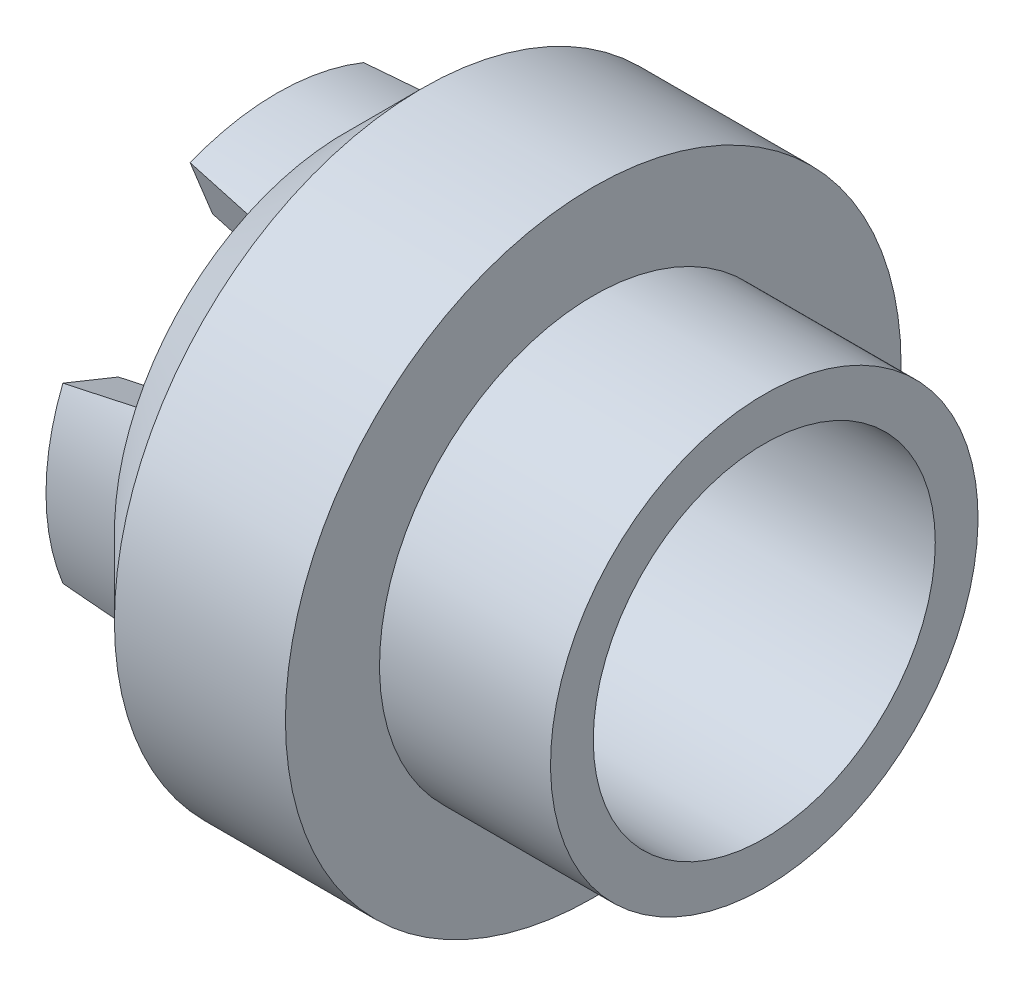
ISO-10303-21;
HEADER;
FILE_DESCRIPTION(('STEP AP214'),'2;1');
FILE_NAME('part.step','',(''),(''),'','','');
FILE_SCHEMA(('AUTOMOTIVE_DESIGN { 1 0 10303 214 1 1 1 1 }'));
ENDSEC;
DATA;
#1=APPLICATION_CONTEXT('core data for automotive mechanical design processes');
#2=APPLICATION_PROTOCOL_DEFINITION('international standard','automotive_design',2000,#1);
#3=PRODUCT_CONTEXT('',#1,'mechanical');
#4=PRODUCT('Part','Part','',(#3));
#5=PRODUCT_RELATED_PRODUCT_CATEGORY('part','',(#4));
#6=PRODUCT_DEFINITION_FORMATION('','',#4);
#7=PRODUCT_DEFINITION_CONTEXT('part definition',#1,'design');
#8=PRODUCT_DEFINITION('design','',#6,#7);
#9=PRODUCT_DEFINITION_SHAPE('','',#8);
#10=(LENGTH_UNIT() NAMED_UNIT(*) SI_UNIT(.MILLI.,.METRE.));
#11=(NAMED_UNIT(*) PLANE_ANGLE_UNIT() SI_UNIT($,.RADIAN.));
#12=(NAMED_UNIT(*) SI_UNIT($,.STERADIAN.) SOLID_ANGLE_UNIT());
#13=UNCERTAINTY_MEASURE_WITH_UNIT(LENGTH_MEASURE(1.E-05),#10,'distance_accuracy_value','');
#14=(GEOMETRIC_REPRESENTATION_CONTEXT(3) GLOBAL_UNCERTAINTY_ASSIGNED_CONTEXT((#13)) GLOBAL_UNIT_ASSIGNED_CONTEXT((#10,
#11,#12)) REPRESENTATION_CONTEXT('',''));
#15=CARTESIAN_POINT('',(0.,0.,0.));
#16=DIRECTION('',(0.,0.,1.));
#17=DIRECTION('',(1.,0.,0.));
#18=AXIS2_PLACEMENT_3D('',#15,#16,#17);
#19=CARTESIAN_POINT('',(-15.5575,0.,0.));
#20=DIRECTION('',(1.,0.,0.));
#21=DIRECTION('',(0.,1.,0.));
#22=AXIS2_PLACEMENT_3D('',#19,#20,#21);
#23=PLANE('',#22);
#24=CARTESIAN_POINT('',(-15.5575,0.,0.));
#25=DIRECTION('',(-1.,0.,0.));
#26=DIRECTION('',(0.,-1.,0.));
#27=AXIS2_PLACEMENT_3D('',#24,#25,#26);
#28=CIRCLE('',#27,8.5725);
#29=CARTESIAN_POINT('',(-15.5575,7.76570118319577,-3.63065302436239));
#30=VERTEX_POINT('',#29);
#31=CARTESIAN_POINT('',(-15.5575,3.63065302436247,-7.76570118319574));
#32=VERTEX_POINT('',#31);
#33=EDGE_CURVE('E246',#30,#32,#28,.T.);
#34=ORIENTED_EDGE('',*,*,#33,.T.);
#35=DIRECTION('',(0.,-0.374606593415919,0.927183854566784));
#36=VECTOR('',#35,1.);
#37=CARTESIAN_POINT('',(-15.5575,2.80266032649904,-5.71634734198931));
#38=LINE('',#37,#36);
#39=CARTESIAN_POINT('',(-15.5575,2.79648659009784,-5.70106680818625));
#40=VERTEX_POINT('',#39);
#41=EDGE_CURVE('E237',#32,#40,#38,.T.);
#42=ORIENTED_EDGE('',*,*,#41,.T.);
#43=CARTESIAN_POINT('',(-15.5575,0.,0.));
#44=DIRECTION('',(1.,0.,0.));
#45=DIRECTION('',(0.,0.,-1.));
#46=AXIS2_PLACEMENT_3D('',#43,#44,#45);
#47=CIRCLE('',#46,6.35);
#48=CARTESIAN_POINT('',(-15.5575,5.70106680818628,-2.79648659009778));
#49=VERTEX_POINT('',#48);
#50=EDGE_CURVE('E182',#40,#49,#47,.T.);
#51=ORIENTED_EDGE('',*,*,#50,.T.);
#52=DIRECTION('',(0.,0.927183854566788,-0.37460659341591));
#53=VECTOR('',#52,1.);
#54=CARTESIAN_POINT('',(-15.5575,7.77701345876403,-3.63522348036584));
#55=LINE('',#54,#53);
#56=EDGE_CURVE('E172',#49,#30,#55,.T.);
#57=ORIENTED_EDGE('',*,*,#56,.T.);
#58=EDGE_LOOP('',(#34,#42,#51,#57));
#59=FACE_BOUND('',#58,.T.);
#60=ADVANCED_FACE('F36',(#59),#23,.F.);
#61=CARTESIAN_POINT('',(-15.5575,-5.70106680818628,-2.79648659009778));
#62=VERTEX_POINT('',#61);
#63=CARTESIAN_POINT('',(-15.5575,-2.79648659009772,-5.70106680818631));
#64=VERTEX_POINT('',#63);
#65=EDGE_CURVE('E187',#62,#64,#47,.T.);
#66=ORIENTED_EDGE('',*,*,#65,.T.);
#67=DIRECTION('',(0.,-0.3746065934159,-0.927183854566792));
#68=VECTOR('',#67,1.);
#69=CARTESIAN_POINT('',(-15.5575,-3.63522348036576,-7.77701345876407));
#70=LINE('',#69,#68);
#71=CARTESIAN_POINT('',(-15.5575,-3.63065302436231,-7.76570118319581));
#72=VERTEX_POINT('',#71);
#73=EDGE_CURVE('E240',#64,#72,#70,.T.);
#74=ORIENTED_EDGE('',*,*,#73,.T.);
#75=CARTESIAN_POINT('',(-15.5575,-7.76570118319577,-3.63065302436239));
#76=VERTEX_POINT('',#75);
#77=EDGE_CURVE('E311',#72,#76,#28,.T.);
#78=ORIENTED_EDGE('',*,*,#77,.T.);
#79=DIRECTION('',(0.,0.927183854566789,0.37460659341591));
#80=VECTOR('',#79,1.);
#81=CARTESIAN_POINT('',(-15.5575,-5.71634734198934,-2.80266032649898));
#82=LINE('',#81,#80);
#83=EDGE_CURVE('E290',#76,#62,#82,.T.);
#84=ORIENTED_EDGE('',*,*,#83,.T.);
#85=EDGE_LOOP('',(#66,#74,#78,#84));
#86=FACE_BOUND('',#85,.T.);
#87=ADVANCED_FACE('F310',(#86),#23,.F.);
#88=CARTESIAN_POINT('',(-15.5575,-2.7964865900978,5.70106680818626));
#89=VERTEX_POINT('',#88);
#90=CARTESIAN_POINT('',(-15.5575,-5.70106680818628,2.79648659009778));
#91=VERTEX_POINT('',#90);
#92=EDGE_CURVE('E180',#89,#91,#47,.T.);
#93=ORIENTED_EDGE('',*,*,#92,.T.);
#94=DIRECTION('',(0.,-0.927183854566788,0.37460659341591));
#95=VECTOR('',#94,1.);
#96=CARTESIAN_POINT('',(-15.5575,-7.77701345876403,3.63522348036584));
#97=LINE('',#96,#95);
#98=CARTESIAN_POINT('',(-15.5575,-7.76570118319578,3.63065302436239));
#99=VERTEX_POINT('',#98);
#100=EDGE_CURVE('E287',#91,#99,#97,.T.);
#101=ORIENTED_EDGE('',*,*,#100,.T.);
#102=CARTESIAN_POINT('',(-15.5575,-3.63065302436242,7.76570118319576));
#103=VERTEX_POINT('',#102);
#104=EDGE_CURVE('E317',#99,#103,#28,.T.);
#105=ORIENTED_EDGE('',*,*,#104,.T.);
#106=DIRECTION('',(0.,0.374606593415913,-0.927183854566787));
#107=VECTOR('',#106,1.);
#108=CARTESIAN_POINT('',(-15.5575,-2.802660326499,5.71634734198933));
#109=LINE('',#108,#107);
#110=EDGE_CURVE('E268',#103,#89,#109,.T.);
#111=ORIENTED_EDGE('',*,*,#110,.T.);
#112=EDGE_LOOP('',(#93,#101,#105,#111));
#113=FACE_BOUND('',#112,.T.);
#114=ADVANCED_FACE('F355',(#113),#23,.F.);
#115=CARTESIAN_POINT('',(-15.5575,5.70106680818628,2.79648659009778));
#116=VERTEX_POINT('',#115);
#117=CARTESIAN_POINT('',(-15.5575,2.79648659009776,5.70106680818629));
#118=VERTEX_POINT('',#117);
#119=EDGE_CURVE('E167',#116,#118,#47,.T.);
#120=ORIENTED_EDGE('',*,*,#119,.T.);
#121=DIRECTION('',(0.,0.374606593415907,0.92718385456679));
#122=VECTOR('',#121,1.);
#123=CARTESIAN_POINT('',(-15.5575,3.63522348036581,7.77701345876404));
#124=LINE('',#123,#122);
#125=CARTESIAN_POINT('',(-15.5575,3.63065302436236,7.76570118319579));
#126=VERTEX_POINT('',#125);
#127=EDGE_CURVE('E160',#118,#126,#124,.T.);
#128=ORIENTED_EDGE('',*,*,#127,.T.);
#129=CARTESIAN_POINT('',(-15.5575,7.76570118319577,3.63065302436239));
#130=VERTEX_POINT('',#129);
#131=EDGE_CURVE('E170',#126,#130,#28,.T.);
#132=ORIENTED_EDGE('',*,*,#131,.T.);
#133=DIRECTION('',(0.,-0.927183854566789,-0.37460659341591));
#134=VECTOR('',#133,1.);
#135=CARTESIAN_POINT('',(-15.5575,5.71634734198934,2.80266032649898));
#136=LINE('',#135,#134);
#137=EDGE_CURVE('E155',#130,#116,#136,.T.);
#138=ORIENTED_EDGE('',*,*,#137,.T.);
#139=EDGE_LOOP('',(#120,#128,#132,#138));
#140=FACE_BOUND('',#139,.T.);
#141=ADVANCED_FACE('F165',(#140),#23,.F.);
#142=CARTESIAN_POINT('',(-12.7,0.,0.));
#143=DIRECTION('',(1.,0.,0.));
#144=DIRECTION('',(0.,1.,0.));
#145=AXIS2_PLACEMENT_3D('',#142,#143,#144);
#146=CONICAL_SURFACE('',#145,11.43,0.78539816339745);
#147=EDGE_CURVE('E173',#130,#30,#28,.T.);
#148=ORIENTED_EDGE('',*,*,#147,.F.);
#149=ORIENTED_EDGE('',*,*,#131,.F.);
#150=CARTESIAN_POINT('',(-15.5575,0.,0.));
#151=DIRECTION('',(-1.,0.,0.));
#152=DIRECTION('',(0.,-1.,0.));
#153=AXIS2_PLACEMENT_3D('',#150,#151,#152);
#154=CIRCLE('',#153,8.5725);
#155=EDGE_CURVE('E204',#103,#126,#154,.T.);
#156=ORIENTED_EDGE('',*,*,#155,.F.);
#157=ORIENTED_EDGE('',*,*,#104,.F.);
#158=CARTESIAN_POINT('',(-15.5575,0.,0.));
#159=DIRECTION('',(-1.,0.,0.));
#160=DIRECTION('',(0.,0.,-1.));
#161=AXIS2_PLACEMENT_3D('',#158,#159,#160);
#162=CIRCLE('',#161,8.5725);
#163=EDGE_CURVE('E210',#76,#99,#162,.T.);
#164=ORIENTED_EDGE('',*,*,#163,.F.);
#165=ORIENTED_EDGE('',*,*,#77,.F.);
#166=CARTESIAN_POINT('',(-15.5575,0.,0.));
#167=DIRECTION('',(-1.,0.,0.));
#168=DIRECTION('',(0.,1.,0.));
#169=AXIS2_PLACEMENT_3D('',#166,#167,#168);
#170=CIRCLE('',#169,8.5725);
#171=EDGE_CURVE('E58',#32,#72,#170,.T.);
#172=ORIENTED_EDGE('',*,*,#171,.F.);
#173=ORIENTED_EDGE('',*,*,#33,.F.);
#174=EDGE_LOOP('',(#148,#149,#156,#157,#164,#165,#172,#173));
#175=FACE_BOUND('',#174,.T.);
#176=CARTESIAN_POINT('',(-12.7,0.,0.));
#177=DIRECTION('',(-1.,0.,0.));
#178=DIRECTION('',(0.,-1.,0.));
#179=AXIS2_PLACEMENT_3D('',#176,#177,#178);
#180=CIRCLE('',#179,11.43);
#181=CARTESIAN_POINT('',(-12.7,-11.43,0.));
#182=VERTEX_POINT('',#181);
#183=EDGE_CURVE('E179',#182,#182,#180,.T.);
#184=ORIENTED_EDGE('',*,*,#183,.T.);
#185=EDGE_LOOP('',(#184));
#186=FACE_BOUND('',#185,.T.);
#187=ADVANCED_FACE('F314',(#175,#186),#146,.T.);
#188=CARTESIAN_POINT('',(0.,0.,0.));
#189=DIRECTION('',(-1.,0.,0.));
#190=DIRECTION('',(0.,-1.,0.));
#191=AXIS2_PLACEMENT_3D('',#188,#189,#190);
#192=PLANE('',#191);
#193=CARTESIAN_POINT('',(0.,0.,0.));
#194=DIRECTION('',(1.,0.,0.));
#195=DIRECTION('',(0.,0.,-1.));
#196=AXIS2_PLACEMENT_3D('',#193,#194,#195);
#197=CIRCLE('',#196,6.35);
#198=CARTESIAN_POINT('',(0.,0.,-6.35));
#199=VERTEX_POINT('',#198);
#200=EDGE_CURVE('E189',#199,#199,#197,.T.);
#201=ORIENTED_EDGE('',*,*,#200,.F.);
#202=EDGE_LOOP('',(#201));
#203=FACE_BOUND('',#202,.T.);
#204=CARTESIAN_POINT('',(0.,0.,0.));
#205=DIRECTION('',(-1.,0.,0.));
#206=DIRECTION('',(0.,-1.,0.));
#207=AXIS2_PLACEMENT_3D('',#204,#205,#206);
#208=CIRCLE('',#207,7.9375);
#209=CARTESIAN_POINT('',(0.,-7.9375,0.));
#210=VERTEX_POINT('',#209);
#211=EDGE_CURVE('E322',#210,#210,#208,.T.);
#212=ORIENTED_EDGE('',*,*,#211,.F.);
#213=EDGE_LOOP('',(#212));
#214=FACE_BOUND('',#213,.T.);
#215=ADVANCED_FACE('F343',(#203,#214),#192,.F.);
#216=CARTESIAN_POINT('',(-18.0975,0.,0.));
#217=DIRECTION('',(-1.,0.,0.));
#218=DIRECTION('',(0.,-1.,0.));
#219=AXIS2_PLACEMENT_3D('',#216,#217,#218);
#220=CYLINDRICAL_SURFACE('',#219,7.9375);
#221=CARTESIAN_POINT('',(-6.35,0.,0.));
#222=DIRECTION('',(-1.,0.,0.));
#223=DIRECTION('',(0.,-1.,0.));
#224=AXIS2_PLACEMENT_3D('',#221,#222,#223);
#225=CIRCLE('',#224,7.9375);
#226=CARTESIAN_POINT('',(-6.35,-7.9375,0.));
#227=VERTEX_POINT('',#226);
#228=EDGE_CURVE('E324',#227,#227,#225,.T.);
#229=ORIENTED_EDGE('',*,*,#228,.F.);
#230=EDGE_LOOP('',(#229));
#231=FACE_BOUND('',#230,.T.);
#232=ORIENTED_EDGE('',*,*,#211,.T.);
#233=EDGE_LOOP('',(#232));
#234=FACE_BOUND('',#233,.T.);
#235=ADVANCED_FACE('F338',(#231,#234),#220,.T.);
#236=CARTESIAN_POINT('',(-6.35,0.,0.));
#237=DIRECTION('',(-1.,0.,0.));
#238=DIRECTION('',(0.,-1.,0.));
#239=AXIS2_PLACEMENT_3D('',#236,#237,#238);
#240=PLANE('',#239);
#241=CARTESIAN_POINT('',(-6.35,0.,0.));
#242=DIRECTION('',(-1.,0.,0.));
#243=DIRECTION('',(0.,-1.,0.));
#244=AXIS2_PLACEMENT_3D('',#241,#242,#243);
#245=CIRCLE('',#244,11.43);
#246=CARTESIAN_POINT('',(-6.35,-11.43,0.));
#247=VERTEX_POINT('',#246);
#248=EDGE_CURVE('E184',#247,#247,#245,.T.);
#249=ORIENTED_EDGE('',*,*,#248,.F.);
#250=EDGE_LOOP('',(#249));
#251=FACE_BOUND('',#250,.T.);
#252=ORIENTED_EDGE('',*,*,#228,.T.);
#253=EDGE_LOOP('',(#252));
#254=FACE_BOUND('',#253,.T.);
#255=ADVANCED_FACE('F335',(#251,#254),#240,.F.);
#256=CARTESIAN_POINT('',(-18.0975,0.,0.));
#257=DIRECTION('',(-1.,0.,0.));
#258=DIRECTION('',(0.,-1.,0.));
#259=AXIS2_PLACEMENT_3D('',#256,#257,#258);
#260=CYLINDRICAL_SURFACE('',#259,11.43);
#261=ORIENTED_EDGE('',*,*,#183,.F.);
#262=EDGE_LOOP('',(#261));
#263=FACE_BOUND('',#262,.T.);
#264=ORIENTED_EDGE('',*,*,#248,.T.);
#265=EDGE_LOOP('',(#264));
#266=FACE_BOUND('',#265,.T.);
#267=ADVANCED_FACE('F333',(#263,#266),#260,.T.);
#268=CARTESIAN_POINT('',(0.,0.,0.));
#269=DIRECTION('',(1.,0.,0.));
#270=DIRECTION('',(0.,0.,-1.));
#271=AXIS2_PLACEMENT_3D('',#268,#269,#270);
#272=CYLINDRICAL_SURFACE('',#271,6.35);
#273=ORIENTED_EDGE('',*,*,#119,.F.);
#274=CARTESIAN_POINT('',(-18.1504100479294,0.,0.));
#275=DIRECTION('',(-0.173648177666927,-0.36891547752548,0.913097848445117));
#276=DIRECTION('',(0.984807753012209,-0.0650497522886883,0.16100378670772));
#277=AXIS2_PLACEMENT_3D('',#274,#275,#276);
#278=ELLIPSE('',#277,36.5681925679627,6.35);
#279=CARTESIAN_POINT('',(-18.0975,5.88411624147391,2.38739943386584));
#280=VERTEX_POINT('',#279);
#281=EDGE_CURVE('E151',#116,#280,#278,.T.);
#282=ORIENTED_EDGE('',*,*,#281,.T.);
#283=CARTESIAN_POINT('',(-18.0975,0.,0.));
#284=DIRECTION('',(-1.,0.,0.));
#285=DIRECTION('',(0.,0.,1.));
#286=AXIS2_PLACEMENT_3D('',#283,#284,#285);
#287=CIRCLE('',#286,6.35);
#288=CARTESIAN_POINT('',(-18.0975,5.88411624147391,-2.38739943386584));
#289=VERTEX_POINT('',#288);
#290=EDGE_CURVE('E199',#289,#280,#287,.F.);
#291=ORIENTED_EDGE('',*,*,#290,.F.);
#292=CARTESIAN_POINT('',(-18.1504100479294,0.,0.));
#293=DIRECTION('',(-0.173648177666928,-0.36891547752548,-0.913097848445117));
#294=DIRECTION('',(0.984807753012209,-0.0650497522886884,-0.16100378670772));
#295=AXIS2_PLACEMENT_3D('',#292,#293,#294);
#296=ELLIPSE('',#295,36.5681925679626,6.35);
#297=EDGE_CURVE('E248',#289,#49,#296,.T.);
#298=ORIENTED_EDGE('',*,*,#297,.T.);
#299=ORIENTED_EDGE('',*,*,#50,.F.);
#300=CARTESIAN_POINT('',(-18.1504100479294,0.,0.));
#301=DIRECTION('',(-0.173648177666928,0.913097848445113,0.36891547752549));
#302=DIRECTION('',(0.984807753012209,0.16100378670772,0.0650497522886901));
#303=AXIS2_PLACEMENT_3D('',#300,#301,#302);
#304=ELLIPSE('',#303,36.5681925679626,6.35);
#305=CARTESIAN_POINT('',(-18.0975,2.3873994338659,-5.88411624147389));
#306=VERTEX_POINT('',#305);
#307=EDGE_CURVE('E12',#40,#306,#304,.T.);
#308=ORIENTED_EDGE('',*,*,#307,.T.);
#309=CARTESIAN_POINT('',(-18.0975,0.,0.));
#310=DIRECTION('',(-1.,0.,0.));
#311=DIRECTION('',(0.,1.,0.));
#312=AXIS2_PLACEMENT_3D('',#309,#310,#311);
#313=CIRCLE('',#312,6.35);
#314=CARTESIAN_POINT('',(-18.0975,-2.38739943386578,-5.88411624147394));
#315=VERTEX_POINT('',#314);
#316=EDGE_CURVE('E51',#315,#306,#313,.F.);
#317=ORIENTED_EDGE('',*,*,#316,.F.);
#318=CARTESIAN_POINT('',(-18.1504100479294,0.,0.));
#319=DIRECTION('',(-0.173648177666927,-0.913097848445121,0.368915477525471));
#320=DIRECTION('',(0.984807753012209,-0.161003786707721,0.0650497522886865));
#321=AXIS2_PLACEMENT_3D('',#318,#319,#320);
#322=ELLIPSE('',#321,36.5681925679628,6.35);
#323=EDGE_CURVE('E234',#315,#64,#322,.T.);
#324=ORIENTED_EDGE('',*,*,#323,.T.);
#325=ORIENTED_EDGE('',*,*,#65,.F.);
#326=CARTESIAN_POINT('',(-18.1504100479294,0.,0.));
#327=DIRECTION('',(-0.173648177666928,0.36891547752548,-0.913097848445117));
#328=DIRECTION('',(0.984807753012209,0.0650497522886884,-0.16100378670772));
#329=AXIS2_PLACEMENT_3D('',#326,#327,#328);
#330=ELLIPSE('',#329,36.5681925679627,6.35);
#331=CARTESIAN_POINT('',(-18.0975,-5.88411624147391,-2.38739943386584));
#332=VERTEX_POINT('',#331);
#333=EDGE_CURVE('E307',#62,#332,#330,.T.);
#334=ORIENTED_EDGE('',*,*,#333,.T.);
#335=CARTESIAN_POINT('',(-18.0975,0.,0.));
#336=DIRECTION('',(-1.,0.,0.));
#337=DIRECTION('',(0.,0.,-1.));
#338=AXIS2_PLACEMENT_3D('',#335,#336,#337);
#339=CIRCLE('',#338,6.35);
#340=CARTESIAN_POINT('',(-18.0975,-5.88411624147391,2.38739943386584));
#341=VERTEX_POINT('',#340);
#342=EDGE_CURVE('E212',#341,#332,#339,.F.);
#343=ORIENTED_EDGE('',*,*,#342,.F.);
#344=CARTESIAN_POINT('',(-18.1504100479293,0.,0.));
#345=DIRECTION('',(-0.173648177666927,0.36891547752548,0.913097848445117));
#346=DIRECTION('',(0.984807753012209,0.0650497522886884,0.16100378670772));
#347=AXIS2_PLACEMENT_3D('',#344,#345,#346);
#348=ELLIPSE('',#347,36.5681925679627,6.35);
#349=EDGE_CURVE('E296',#341,#91,#348,.T.);
#350=ORIENTED_EDGE('',*,*,#349,.T.);
#351=ORIENTED_EDGE('',*,*,#92,.F.);
#352=CARTESIAN_POINT('',(-18.1504100479294,0.,0.));
#353=DIRECTION('',(-0.173648177666927,-0.913097848445116,-0.368915477525483));
#354=DIRECTION('',(0.984807753012209,-0.16100378670772,-0.0650497522886888));
#355=AXIS2_PLACEMENT_3D('',#352,#353,#354);
#356=ELLIPSE('',#355,36.5681925679627,6.35);
#357=CARTESIAN_POINT('',(-18.0975,-2.38739943386586,5.8841162414739));
#358=VERTEX_POINT('',#357);
#359=EDGE_CURVE('E284',#89,#358,#356,.T.);
#360=ORIENTED_EDGE('',*,*,#359,.T.);
#361=CARTESIAN_POINT('',(-18.0975,0.,0.));
#362=DIRECTION('',(-1.,0.,0.));
#363=DIRECTION('',(0.,-1.,0.));
#364=AXIS2_PLACEMENT_3D('',#361,#362,#363);
#365=CIRCLE('',#364,6.35);
#366=CARTESIAN_POINT('',(-18.0975,2.38739943386581,5.88411624147392));
#367=VERTEX_POINT('',#366);
#368=EDGE_CURVE('E206',#367,#358,#365,.F.);
#369=ORIENTED_EDGE('',*,*,#368,.F.);
#370=CARTESIAN_POINT('',(-18.1504100479293,0.,0.));
#371=DIRECTION('',(-0.173648177666927,0.913097848445119,-0.368915477525477));
#372=DIRECTION('',(0.984807753012209,0.16100378670772,-0.0650497522886878));
#373=AXIS2_PLACEMENT_3D('',#370,#371,#372);
#374=ELLIPSE('',#373,36.5681925679627,6.35);
#375=EDGE_CURVE('E178',#367,#118,#374,.T.);
#376=ORIENTED_EDGE('',*,*,#375,.T.);
#377=EDGE_LOOP('',(#273,#282,#291,#298,#299,#308,#317,#324,#325,#334,#343,#350,#351,#360,#369,#376));
#378=FACE_BOUND('',#377,.T.);
#379=ORIENTED_EDGE('',*,*,#200,.T.);
#380=EDGE_LOOP('',(#379));
#381=FACE_BOUND('',#380,.T.);
#382=ADVANCED_FACE('F175',(#378,#381),#272,.F.);
#383=CARTESIAN_POINT('',(-18.0975,0.,0.));
#384=DIRECTION('',(1.,0.,0.));
#385=DIRECTION('',(0.,0.,-1.));
#386=AXIS2_PLACEMENT_3D('',#383,#384,#385);
#387=CYLINDRICAL_SURFACE('',#386,8.5725);
#388=ORIENTED_EDGE('',*,*,#147,.T.);
#389=CARTESIAN_POINT('',(-18.1504100479294,0.,0.));
#390=DIRECTION('',(-0.173648177666928,-0.36891547752548,-0.913097848445117));
#391=DIRECTION('',(0.984807753012209,-0.0650497522886884,-0.16100378670772));
#392=AXIS2_PLACEMENT_3D('',#389,#390,#391);
#393=ELLIPSE('',#392,49.3670599667496,8.5725);
#394=CARTESIAN_POINT('',(-18.0975,7.94478400569314,-3.2199632533435));
#395=VERTEX_POINT('',#394);
#396=EDGE_CURVE('E253',#30,#395,#393,.F.);
#397=ORIENTED_EDGE('',*,*,#396,.T.);
#398=CARTESIAN_POINT('',(-18.0975,0.,0.));
#399=DIRECTION('',(-1.,0.,0.));
#400=DIRECTION('',(0.,0.,1.));
#401=AXIS2_PLACEMENT_3D('',#398,#399,#400);
#402=CIRCLE('',#401,8.5725);
#403=CARTESIAN_POINT('',(-18.0975,7.94478400569314,3.2199632533435));
#404=VERTEX_POINT('',#403);
#405=EDGE_CURVE('E197',#404,#395,#402,.T.);
#406=ORIENTED_EDGE('',*,*,#405,.F.);
#407=CARTESIAN_POINT('',(-18.1504100479294,0.,0.));
#408=DIRECTION('',(-0.173648177666927,-0.36891547752548,0.913097848445117));
#409=DIRECTION('',(0.984807753012209,-0.0650497522886883,0.16100378670772));
#410=AXIS2_PLACEMENT_3D('',#407,#408,#409);
#411=ELLIPSE('',#410,49.3670599667497,8.5725);
#412=EDGE_CURVE('E161',#404,#130,#411,.F.);
#413=ORIENTED_EDGE('',*,*,#412,.T.);
#414=EDGE_LOOP('',(#388,#397,#406,#413));
#415=FACE_BOUND('',#414,.T.);
#416=ADVANCED_FACE('F320',(#415),#387,.T.);
#417=CARTESIAN_POINT('',(-18.0975,0.,0.));
#418=DIRECTION('',(-1.,0.,0.));
#419=DIRECTION('',(0.,0.,1.));
#420=AXIS2_PLACEMENT_3D('',#417,#418,#419);
#421=PLANE('',#420);
#422=ORIENTED_EDGE('',*,*,#290,.T.);
#423=DIRECTION('',(0.,-0.927183854566788,-0.37460659341591));
#424=VECTOR('',#423,1.);
#425=CARTESIAN_POINT('',(-18.0975,-0.0034948806006668,0.00865013302897009));
#426=LINE('',#425,#424);
#427=EDGE_CURVE('E157',#280,#404,#426,.F.);
#428=ORIENTED_EDGE('',*,*,#427,.T.);
#429=ORIENTED_EDGE('',*,*,#405,.T.);
#430=DIRECTION('',(0.,0.927183854566788,-0.37460659341591));
#431=VECTOR('',#430,1.);
#432=CARTESIAN_POINT('',(-18.0975,-0.00349488060066599,-0.0086501330289681));
#433=LINE('',#432,#431);
#434=EDGE_CURVE('E254',#395,#289,#433,.F.);
#435=ORIENTED_EDGE('',*,*,#434,.T.);
#436=EDGE_LOOP('',(#422,#428,#429,#435));
#437=FACE_BOUND('',#436,.T.);
#438=ADVANCED_FACE('F400',(#437),#421,.T.);
#439=CARTESIAN_POINT('',(-18.1504100479294,0.,0.));
#440=DIRECTION('',(-0.173648177666928,-0.36891547752548,-0.913097848445117));
#441=DIRECTION('',(0.,0.927183854566788,-0.37460659341591));
#442=AXIS2_PLACEMENT_3D('',#439,#440,#441);
#443=PLANE('',#442);
#444=ORIENTED_EDGE('',*,*,#396,.F.);
#445=ORIENTED_EDGE('',*,*,#56,.F.);
#446=ORIENTED_EDGE('',*,*,#297,.F.);
#447=ORIENTED_EDGE('',*,*,#434,.F.);
#448=EDGE_LOOP('',(#444,#445,#446,#447));
#449=FACE_BOUND('',#448,.T.);
#450=ADVANCED_FACE('F257',(#449),#443,.T.);
#451=CARTESIAN_POINT('',(-18.1504100479294,0.,0.));
#452=DIRECTION('',(-0.173648177666927,-0.36891547752548,0.913097848445117));
#453=DIRECTION('',(0.,-0.927183854566788,-0.37460659341591));
#454=AXIS2_PLACEMENT_3D('',#451,#452,#453);
#455=PLANE('',#454);
#456=ORIENTED_EDGE('',*,*,#281,.F.);
#457=ORIENTED_EDGE('',*,*,#137,.F.);
#458=ORIENTED_EDGE('',*,*,#412,.F.);
#459=ORIENTED_EDGE('',*,*,#427,.F.);
#460=EDGE_LOOP('',(#456,#457,#458,#459));
#461=FACE_BOUND('',#460,.T.);
#462=ADVANCED_FACE('F153',(#461),#455,.T.);
#463=CARTESIAN_POINT('',(-18.0975,0.,0.));
#464=DIRECTION('',(1.,0.,0.));
#465=DIRECTION('',(0.,1.,0.));
#466=AXIS2_PLACEMENT_3D('',#463,#464,#465);
#467=CYLINDRICAL_SURFACE('',#466,8.5725);
#468=ORIENTED_EDGE('',*,*,#155,.T.);
#469=CARTESIAN_POINT('',(-18.1504100479294,0.,0.));
#470=DIRECTION('',(-0.173648177666927,0.913097848445119,-0.368915477525477));
#471=DIRECTION('',(0.984807753012209,0.16100378670772,-0.0650497522886878));
#472=AXIS2_PLACEMENT_3D('',#469,#470,#471);
#473=ELLIPSE('',#472,49.3670599667497,8.5725);
#474=CARTESIAN_POINT('',(-18.0975,3.21996325334347,7.94478400569315));
#475=VERTEX_POINT('',#474);
#476=EDGE_CURVE('E275',#126,#475,#473,.F.);
#477=ORIENTED_EDGE('',*,*,#476,.T.);
#478=CARTESIAN_POINT('',(-18.0975,0.,0.));
#479=DIRECTION('',(-1.,0.,0.));
#480=DIRECTION('',(0.,-1.,0.));
#481=AXIS2_PLACEMENT_3D('',#478,#479,#480);
#482=CIRCLE('',#481,8.5725);
#483=CARTESIAN_POINT('',(-18.0975,-3.21996325334353,7.94478400569313));
#484=VERTEX_POINT('',#483);
#485=EDGE_CURVE('E203',#484,#475,#482,.T.);
#486=ORIENTED_EDGE('',*,*,#485,.F.);
#487=CARTESIAN_POINT('',(-18.1504100479294,0.,0.));
#488=DIRECTION('',(-0.173648177666927,-0.913097848445116,-0.368915477525483));
#489=DIRECTION('',(0.984807753012209,-0.16100378670772,-0.0650497522886889));
#490=AXIS2_PLACEMENT_3D('',#487,#488,#489);
#491=ELLIPSE('',#490,49.3670599667497,8.5725);
#492=EDGE_CURVE('E281',#484,#103,#491,.F.);
#493=ORIENTED_EDGE('',*,*,#492,.T.);
#494=EDGE_LOOP('',(#468,#477,#486,#493));
#495=FACE_BOUND('',#494,.T.);
#496=ADVANCED_FACE('F395',(#495),#467,.T.);
#497=CARTESIAN_POINT('',(-18.0975,0.,0.));
#498=DIRECTION('',(-1.,0.,0.));
#499=DIRECTION('',(0.,-1.,0.));
#500=AXIS2_PLACEMENT_3D('',#497,#498,#499);
#501=PLANE('',#500);
#502=ORIENTED_EDGE('',*,*,#368,.T.);
#503=DIRECTION('',(0.,0.374606593415913,-0.927183854566787));
#504=VECTOR('',#503,1.);
#505=CARTESIAN_POINT('',(-18.0975,-0.0086501330289718,-0.00349488060066509));
#506=LINE('',#505,#504);
#507=EDGE_CURVE('E278',#358,#484,#506,.F.);
#508=ORIENTED_EDGE('',*,*,#507,.T.);
#509=ORIENTED_EDGE('',*,*,#485,.T.);
#510=DIRECTION('',(0.,0.374606593415907,0.92718385456679));
#511=VECTOR('',#510,1.);
#512=CARTESIAN_POINT('',(-18.0975,0.00865013302896636,-0.00349488060066422));
#513=LINE('',#512,#511);
#514=EDGE_CURVE('E271',#475,#367,#513,.F.);
#515=ORIENTED_EDGE('',*,*,#514,.T.);
#516=EDGE_LOOP('',(#502,#508,#509,#515));
#517=FACE_BOUND('',#516,.T.);
#518=ADVANCED_FACE('F389',(#517),#501,.T.);
#519=CARTESIAN_POINT('',(-18.0975,0.,0.));
#520=DIRECTION('',(1.,0.,0.));
#521=DIRECTION('',(0.,1.,0.));
#522=AXIS2_PLACEMENT_3D('',#519,#520,#521);
#523=CYLINDRICAL_SURFACE('',#522,8.5725);
#524=ORIENTED_EDGE('',*,*,#163,.T.);
#525=CARTESIAN_POINT('',(-18.1504100479294,0.,0.));
#526=DIRECTION('',(-0.173648177666927,0.36891547752548,0.913097848445117));
#527=DIRECTION('',(0.984807753012209,0.0650497522886885,0.16100378670772));
#528=AXIS2_PLACEMENT_3D('',#525,#526,#527);
#529=ELLIPSE('',#528,49.3670599667496,8.5725);
#530=CARTESIAN_POINT('',(-18.0975,-7.94478400569314,3.2199632533435));
#531=VERTEX_POINT('',#530);
#532=EDGE_CURVE('E298',#99,#531,#529,.F.);
#533=ORIENTED_EDGE('',*,*,#532,.T.);
#534=CARTESIAN_POINT('',(-18.0975,0.,0.));
#535=DIRECTION('',(-1.,0.,0.));
#536=DIRECTION('',(0.,0.,-1.));
#537=AXIS2_PLACEMENT_3D('',#534,#535,#536);
#538=CIRCLE('',#537,8.5725);
#539=CARTESIAN_POINT('',(-18.0975,-7.94478400569314,-3.2199632533435));
#540=VERTEX_POINT('',#539);
#541=EDGE_CURVE('E207',#540,#531,#538,.T.);
#542=ORIENTED_EDGE('',*,*,#541,.F.);
#543=CARTESIAN_POINT('',(-18.1504100479294,0.,0.));
#544=DIRECTION('',(-0.173648177666928,0.36891547752548,-0.913097848445117));
#545=DIRECTION('',(0.984807753012209,0.0650497522886885,-0.16100378670772));
#546=AXIS2_PLACEMENT_3D('',#543,#544,#545);
#547=ELLIPSE('',#546,49.3670599667496,8.5725);
#548=EDGE_CURVE('E304',#540,#76,#547,.F.);
#549=ORIENTED_EDGE('',*,*,#548,.T.);
#550=EDGE_LOOP('',(#524,#533,#542,#549));
#551=FACE_BOUND('',#550,.T.);
#552=ADVANCED_FACE('F374',(#551),#523,.T.);
#553=CARTESIAN_POINT('',(-18.0975,0.,0.));
#554=DIRECTION('',(-1.,0.,0.));
#555=DIRECTION('',(0.,0.,-1.));
#556=AXIS2_PLACEMENT_3D('',#553,#554,#555);
#557=PLANE('',#556);
#558=ORIENTED_EDGE('',*,*,#342,.T.);
#559=DIRECTION('',(0.,0.927183854566788,0.37460659341591));
#560=VECTOR('',#559,1.);
#561=CARTESIAN_POINT('',(-18.0975,0.00349488060066333,-0.0086501330289701));
#562=LINE('',#561,#560);
#563=EDGE_CURVE('E301',#332,#540,#562,.F.);
#564=ORIENTED_EDGE('',*,*,#563,.T.);
#565=ORIENTED_EDGE('',*,*,#541,.T.);
#566=DIRECTION('',(0.,-0.927183854566788,0.37460659341591));
#567=VECTOR('',#566,1.);
#568=CARTESIAN_POINT('',(-18.0975,0.00349488060066252,0.00865013302896809));
#569=LINE('',#568,#567);
#570=EDGE_CURVE('E293',#531,#341,#569,.F.);
#571=ORIENTED_EDGE('',*,*,#570,.T.);
#572=EDGE_LOOP('',(#558,#564,#565,#571));
#573=FACE_BOUND('',#572,.T.);
#574=ADVANCED_FACE('F381',(#573),#557,.T.);
#575=CARTESIAN_POINT('',(-18.0975,0.,0.));
#576=DIRECTION('',(1.,0.,0.));
#577=DIRECTION('',(0.,0.,-1.));
#578=AXIS2_PLACEMENT_3D('',#575,#576,#577);
#579=CYLINDRICAL_SURFACE('',#578,8.5725);
#580=ORIENTED_EDGE('',*,*,#171,.T.);
#581=CARTESIAN_POINT('',(-18.1504100479294,0.,0.));
#582=DIRECTION('',(-0.173648177666927,-0.913097848445121,0.368915477525471));
#583=DIRECTION('',(0.984807753012209,-0.161003786707721,0.0650497522886866));
#584=AXIS2_PLACEMENT_3D('',#581,#582,#583);
#585=ELLIPSE('',#584,49.3670599667497,8.5725);
#586=CARTESIAN_POINT('',(-18.0975,-3.21996325334342,-7.94478400569318));
#587=VERTEX_POINT('',#586);
#588=EDGE_CURVE('E229',#72,#587,#585,.F.);
#589=ORIENTED_EDGE('',*,*,#588,.T.);
#590=CARTESIAN_POINT('',(-18.0975,0.,0.));
#591=DIRECTION('',(-1.,0.,0.));
#592=DIRECTION('',(0.,1.,0.));
#593=AXIS2_PLACEMENT_3D('',#590,#591,#592);
#594=CIRCLE('',#593,8.5725);
#595=CARTESIAN_POINT('',(-18.0975,3.21996325334358,-7.94478400569311));
#596=VERTEX_POINT('',#595);
#597=EDGE_CURVE('E213',#596,#587,#594,.T.);
#598=ORIENTED_EDGE('',*,*,#597,.F.);
#599=CARTESIAN_POINT('',(-18.1504100479294,0.,0.));
#600=DIRECTION('',(-0.173648177666928,0.913097848445113,0.36891547752549));
#601=DIRECTION('',(0.984807753012209,0.16100378670772,0.0650497522886901));
#602=AXIS2_PLACEMENT_3D('',#599,#600,#601);
#603=ELLIPSE('',#602,49.3670599667496,8.5725);
#604=EDGE_CURVE('E44',#596,#32,#603,.F.);
#605=ORIENTED_EDGE('',*,*,#604,.T.);
#606=EDGE_LOOP('',(#580,#589,#598,#605));
#607=FACE_BOUND('',#606,.T.);
#608=ADVANCED_FACE('F230',(#607),#579,.T.);
#609=CARTESIAN_POINT('',(-18.0975,0.,0.));
#610=DIRECTION('',(-1.,0.,0.));
#611=DIRECTION('',(0.,1.,0.));
#612=AXIS2_PLACEMENT_3D('',#609,#610,#611);
#613=PLANE('',#612);
#614=ORIENTED_EDGE('',*,*,#316,.T.);
#615=DIRECTION('',(0.,-0.374606593415919,0.927183854566784));
#616=VECTOR('',#615,1.);
#617=CARTESIAN_POINT('',(-18.0975,0.00865013302896833,0.00349488060066516));
#618=LINE('',#617,#616);
#619=EDGE_CURVE('E224',#306,#596,#618,.F.);
#620=ORIENTED_EDGE('',*,*,#619,.T.);
#621=ORIENTED_EDGE('',*,*,#597,.T.);
#622=DIRECTION('',(0.,-0.3746065934159,-0.927183854566792));
#623=VECTOR('',#622,1.);
#624=CARTESIAN_POINT('',(-18.0975,-0.00865013302896984,0.00349488060066416));
#625=LINE('',#624,#623);
#626=EDGE_CURVE('E221',#587,#315,#625,.F.);
#627=ORIENTED_EDGE('',*,*,#626,.T.);
#628=EDGE_LOOP('',(#614,#620,#621,#627));
#629=FACE_BOUND('',#628,.T.);
#630=ADVANCED_FACE('F219',(#629),#613,.T.);
#631=CARTESIAN_POINT('',(-18.1504100479294,0.,0.));
#632=DIRECTION('',(-0.173648177666927,0.913097848445119,-0.368915477525477));
#633=DIRECTION('',(0.,0.374606593415907,0.92718385456679));
#634=AXIS2_PLACEMENT_3D('',#631,#632,#633);
#635=PLANE('',#634);
#636=ORIENTED_EDGE('',*,*,#476,.F.);
#637=ORIENTED_EDGE('',*,*,#127,.F.);
#638=ORIENTED_EDGE('',*,*,#375,.F.);
#639=ORIENTED_EDGE('',*,*,#514,.F.);
#640=EDGE_LOOP('',(#636,#637,#638,#639));
#641=FACE_BOUND('',#640,.T.);
#642=ADVANCED_FACE('F476',(#641),#635,.T.);
#643=CARTESIAN_POINT('',(-18.1504100479294,0.,0.));
#644=DIRECTION('',(-0.173648177666927,-0.913097848445116,-0.368915477525483));
#645=DIRECTION('',(0.,0.374606593415913,-0.927183854566787));
#646=AXIS2_PLACEMENT_3D('',#643,#644,#645);
#647=PLANE('',#646);
#648=ORIENTED_EDGE('',*,*,#359,.F.);
#649=ORIENTED_EDGE('',*,*,#110,.F.);
#650=ORIENTED_EDGE('',*,*,#492,.F.);
#651=ORIENTED_EDGE('',*,*,#507,.F.);
#652=EDGE_LOOP('',(#648,#649,#650,#651));
#653=FACE_BOUND('',#652,.T.);
#654=ADVANCED_FACE('F484',(#653),#647,.T.);
#655=CARTESIAN_POINT('',(-18.1504100479294,0.,0.));
#656=DIRECTION('',(-0.173648177666927,0.36891547752548,0.913097848445117));
#657=DIRECTION('',(0.,-0.927183854566788,0.37460659341591));
#658=AXIS2_PLACEMENT_3D('',#655,#656,#657);
#659=PLANE('',#658);
#660=ORIENTED_EDGE('',*,*,#532,.F.);
#661=ORIENTED_EDGE('',*,*,#100,.F.);
#662=ORIENTED_EDGE('',*,*,#349,.F.);
#663=ORIENTED_EDGE('',*,*,#570,.F.);
#664=EDGE_LOOP('',(#660,#661,#662,#663));
#665=FACE_BOUND('',#664,.T.);
#666=ADVANCED_FACE('F371',(#665),#659,.T.);
#667=CARTESIAN_POINT('',(-18.1504100479294,0.,0.));
#668=DIRECTION('',(-0.173648177666928,0.36891547752548,-0.913097848445117));
#669=DIRECTION('',(0.,0.927183854566788,0.37460659341591));
#670=AXIS2_PLACEMENT_3D('',#667,#668,#669);
#671=PLANE('',#670);
#672=ORIENTED_EDGE('',*,*,#333,.F.);
#673=ORIENTED_EDGE('',*,*,#83,.F.);
#674=ORIENTED_EDGE('',*,*,#548,.F.);
#675=ORIENTED_EDGE('',*,*,#563,.F.);
#676=EDGE_LOOP('',(#672,#673,#674,#675));
#677=FACE_BOUND('',#676,.T.);
#678=ADVANCED_FACE('F379',(#677),#671,.T.);
#679=CARTESIAN_POINT('',(-18.1504100479294,0.,0.));
#680=DIRECTION('',(-0.173648177666927,-0.913097848445121,0.368915477525471));
#681=DIRECTION('',(0.,-0.3746065934159,-0.927183854566792));
#682=AXIS2_PLACEMENT_3D('',#679,#680,#681);
#683=PLANE('',#682);
#684=ORIENTED_EDGE('',*,*,#588,.F.);
#685=ORIENTED_EDGE('',*,*,#73,.F.);
#686=ORIENTED_EDGE('',*,*,#323,.F.);
#687=ORIENTED_EDGE('',*,*,#626,.F.);
#688=EDGE_LOOP('',(#684,#685,#686,#687));
#689=FACE_BOUND('',#688,.T.);
#690=ADVANCED_FACE('F236',(#689),#683,.T.);
#691=CARTESIAN_POINT('',(-18.1504100479294,0.,0.));
#692=DIRECTION('',(-0.173648177666928,0.913097848445113,0.36891547752549));
#693=DIRECTION('',(0.,-0.374606593415919,0.927183854566784));
#694=AXIS2_PLACEMENT_3D('',#691,#692,#693);
#695=PLANE('',#694);
#696=ORIENTED_EDGE('',*,*,#307,.F.);
#697=ORIENTED_EDGE('',*,*,#41,.F.);
#698=ORIENTED_EDGE('',*,*,#604,.F.);
#699=ORIENTED_EDGE('',*,*,#619,.F.);
#700=EDGE_LOOP('',(#696,#697,#698,#699));
#701=FACE_BOUND('',#700,.T.);
#702=ADVANCED_FACE('F38',(#701),#695,.T.);
#703=CLOSED_SHELL('',(#60,#87,#114,#141,#187,#215,#235,#255,#267,#382,#416,#438,#450,#462,#496,
#518,#552,#574,#608,#630,#642,#654,#666,#678,#690,#702));
#704=MANIFOLD_SOLID_BREP('B2',#703);
#705=ADVANCED_BREP_SHAPE_REPRESENTATION('',(#18,#704),#14);
#706=SHAPE_DEFINITION_REPRESENTATION(#9,#705);
ENDSEC;
END-ISO-10303-21;
